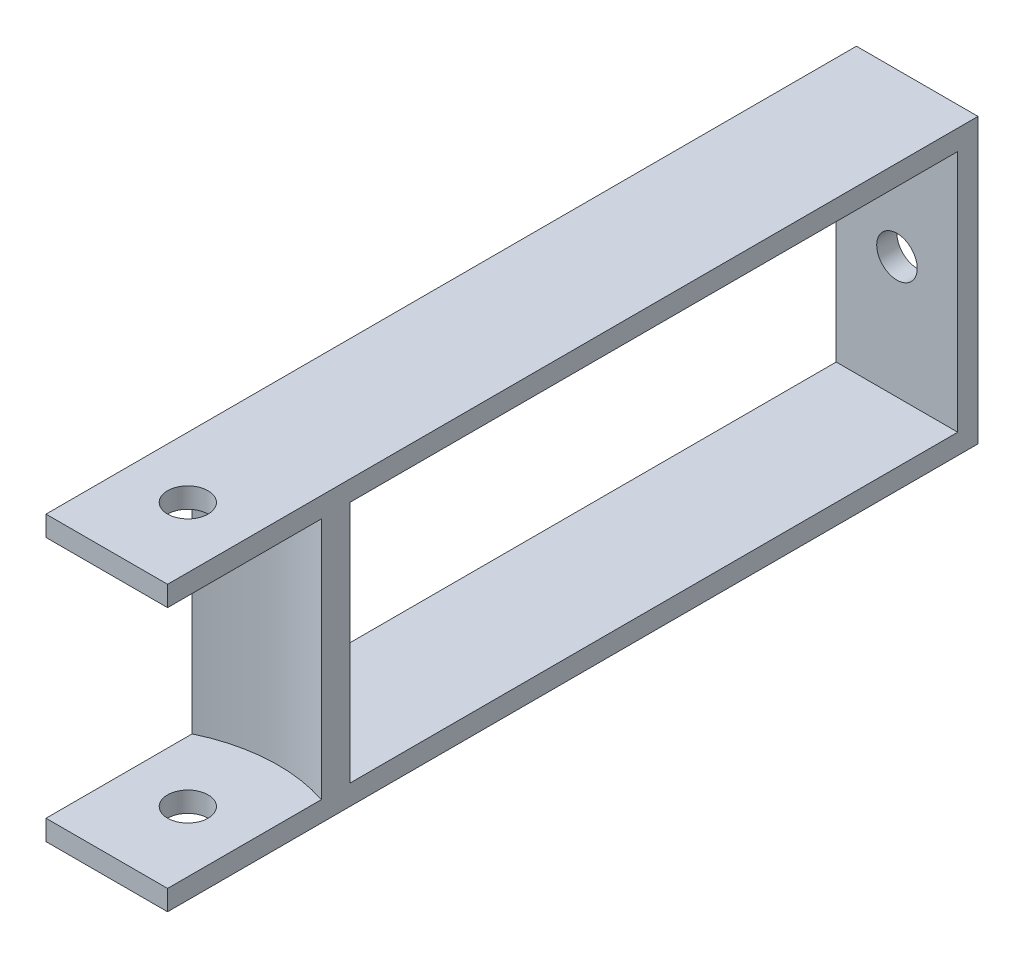
ISO-10303-21;
HEADER;
FILE_DESCRIPTION(('STEP AP214'),'2;1');
FILE_NAME('part.step','',(''),(''),'','','');
FILE_SCHEMA(('AUTOMOTIVE_DESIGN { 1 0 10303 214 1 1 1 1 }'));
ENDSEC;
DATA;
#1=APPLICATION_CONTEXT('core data for automotive mechanical design processes');
#2=APPLICATION_PROTOCOL_DEFINITION('international standard','automotive_design',2000,#1);
#3=PRODUCT_CONTEXT('',#1,'mechanical');
#4=PRODUCT('Part','Part','',(#3));
#5=PRODUCT_RELATED_PRODUCT_CATEGORY('part','',(#4));
#6=PRODUCT_DEFINITION_FORMATION('','',#4);
#7=PRODUCT_DEFINITION_CONTEXT('part definition',#1,'design');
#8=PRODUCT_DEFINITION('design','',#6,#7);
#9=PRODUCT_DEFINITION_SHAPE('','',#8);
#10=(LENGTH_UNIT() NAMED_UNIT(*) SI_UNIT(.MILLI.,.METRE.));
#11=(NAMED_UNIT(*) PLANE_ANGLE_UNIT() SI_UNIT($,.RADIAN.));
#12=(NAMED_UNIT(*) SI_UNIT($,.STERADIAN.) SOLID_ANGLE_UNIT());
#13=UNCERTAINTY_MEASURE_WITH_UNIT(LENGTH_MEASURE(1.E-05),#10,'distance_accuracy_value','');
#14=(GEOMETRIC_REPRESENTATION_CONTEXT(3) GLOBAL_UNCERTAINTY_ASSIGNED_CONTEXT((#13)) GLOBAL_UNIT_ASSIGNED_CONTEXT((#10,
#11,#12)) REPRESENTATION_CONTEXT('',''));
#15=CARTESIAN_POINT('',(0.,0.,0.));
#16=DIRECTION('',(0.,0.,1.));
#17=DIRECTION('',(1.,0.,0.));
#18=AXIS2_PLACEMENT_3D('',#15,#16,#17);
#19=CARTESIAN_POINT('',(0.,0.,200.));
#20=DIRECTION('',(0.,0.,-1.));
#21=DIRECTION('',(-1.,0.,0.));
#22=AXIS2_PLACEMENT_3D('',#19,#20,#21);
#23=PLANE('',#22);
#24=DIRECTION('',(-1.,0.,0.));
#25=VECTOR('',#24,1.);
#26=CARTESIAN_POINT('',(0.,43.2919254658385,200.));
#27=LINE('',#26,#25);
#28=CARTESIAN_POINT('',(19.9378881987578,43.2919254658385,200.));
#29=VERTEX_POINT('',#28);
#30=CARTESIAN_POINT('',(-10.0621118012422,43.2919254658385,200.));
#31=VERTEX_POINT('',#30);
#32=EDGE_CURVE('E223',#29,#31,#27,.T.);
#33=ORIENTED_EDGE('',*,*,#32,.F.);
#34=DIRECTION('',(0.,1.,0.));
#35=VECTOR('',#34,1.);
#36=CARTESIAN_POINT('',(19.9378881987578,-21.7080745341615,200.));
#37=LINE('',#36,#35);
#38=CARTESIAN_POINT('',(19.9378881987578,48.2919254658385,200.));
#39=VERTEX_POINT('',#38);
#40=EDGE_CURVE('E197',#29,#39,#37,.T.);
#41=ORIENTED_EDGE('',*,*,#40,.T.);
#42=DIRECTION('',(-1.,0.,0.));
#43=VECTOR('',#42,1.);
#44=CARTESIAN_POINT('',(-10.0621118012422,48.2919254658385,200.));
#45=LINE('',#44,#43);
#46=CARTESIAN_POINT('',(-10.0621118012422,48.2919254658385,200.));
#47=VERTEX_POINT('',#46);
#48=EDGE_CURVE('E201',#39,#47,#45,.T.);
#49=ORIENTED_EDGE('',*,*,#48,.T.);
#50=DIRECTION('',(0.,-1.,0.));
#51=VECTOR('',#50,1.);
#52=CARTESIAN_POINT('',(-10.0621118012422,-21.7080745341615,200.));
#53=LINE('',#52,#51);
#54=EDGE_CURVE('E191',#47,#31,#53,.T.);
#55=ORIENTED_EDGE('',*,*,#54,.T.);
#56=EDGE_LOOP('',(#33,#41,#49,#55));
#57=FACE_BOUND('',#56,.T.);
#58=ADVANCED_FACE('F38',(#57),#23,.F.);
#59=CARTESIAN_POINT('',(-10.0621118012422,-21.7080745341615,200.));
#60=DIRECTION('',(1.,0.,0.));
#61=DIRECTION('',(0.,1.,0.));
#62=AXIS2_PLACEMENT_3D('',#59,#60,#61);
#63=PLANE('',#62);
#64=DIRECTION('',(0.,0.,1.));
#65=VECTOR('',#64,1.);
#66=CARTESIAN_POINT('',(-10.0621118012422,-16.7080745341615,5.00000000000001));
#67=LINE('',#66,#65);
#68=CARTESIAN_POINT('',(-10.0621118012422,-16.7080745341615,5.));
#69=VERTEX_POINT('',#68);
#70=CARTESIAN_POINT('',(-10.0621118012422,-16.7080745341615,155.));
#71=VERTEX_POINT('',#70);
#72=EDGE_CURVE('E159',#69,#71,#67,.T.);
#73=ORIENTED_EDGE('',*,*,#72,.F.);
#74=DIRECTION('',(0.,-1.,0.));
#75=VECTOR('',#74,1.);
#76=CARTESIAN_POINT('',(-10.0621118012422,43.2919254658385,5.));
#77=LINE('',#76,#75);
#78=CARTESIAN_POINT('',(-10.0621118012422,43.2919254658385,5.));
#79=VERTEX_POINT('',#78);
#80=EDGE_CURVE('E55',#79,#69,#77,.T.);
#81=ORIENTED_EDGE('',*,*,#80,.F.);
#82=DIRECTION('',(0.,0.,-1.));
#83=VECTOR('',#82,1.);
#84=CARTESIAN_POINT('',(-10.0621118012422,43.2919254658385,5.));
#85=LINE('',#84,#83);
#86=CARTESIAN_POINT('',(-10.0621118012422,43.2919254658385,155.));
#87=VERTEX_POINT('',#86);
#88=EDGE_CURVE('E147',#87,#79,#85,.T.);
#89=ORIENTED_EDGE('',*,*,#88,.F.);
#90=DIRECTION('',(0.,1.,0.));
#91=VECTOR('',#90,1.);
#92=CARTESIAN_POINT('',(-10.0621118012422,43.2919254658385,155.));
#93=LINE('',#92,#91);
#94=EDGE_CURVE('E150',#71,#87,#93,.T.);
#95=ORIENTED_EDGE('',*,*,#94,.F.);
#96=EDGE_LOOP('',(#73,#81,#89,#95));
#97=FACE_BOUND('',#96,.T.);
#98=CARTESIAN_POINT('',(-10.0621118012422,-16.7080745341615,200.));
#99=VERTEX_POINT('',#98);
#100=CARTESIAN_POINT('',(-10.0621118012422,-21.7080745341615,200.));
#101=VERTEX_POINT('',#100);
#102=EDGE_CURVE('E195',#99,#101,#53,.T.);
#103=ORIENTED_EDGE('',*,*,#102,.F.);
#104=DIRECTION('',(0.,0.,-1.));
#105=VECTOR('',#104,1.);
#106=CARTESIAN_POINT('',(-10.0621118012422,-16.7080745341615,200.));
#107=LINE('',#106,#105);
#108=CARTESIAN_POINT('',(-10.0621118012422,-16.7080745341615,163.943139812882));
#109=VERTEX_POINT('',#108);
#110=EDGE_CURVE('E182',#99,#109,#107,.T.);
#111=ORIENTED_EDGE('',*,*,#110,.T.);
#112=DIRECTION('',(0.,1.,0.));
#113=VECTOR('',#112,1.);
#114=CARTESIAN_POINT('',(-10.0621118012422,-16.7080745341615,163.943139812882));
#115=LINE('',#114,#113);
#116=CARTESIAN_POINT('',(-10.0621118012422,43.2919254658385,163.943139812882));
#117=VERTEX_POINT('',#116);
#118=EDGE_CURVE('E185',#117,#109,#115,.F.);
#119=ORIENTED_EDGE('',*,*,#118,.F.);
#120=DIRECTION('',(0.,0.,-1.));
#121=VECTOR('',#120,1.);
#122=CARTESIAN_POINT('',(-10.0621118012422,43.2919254658385,200.));
#123=LINE('',#122,#121);
#124=EDGE_CURVE('E177',#31,#117,#123,.T.);
#125=ORIENTED_EDGE('',*,*,#124,.F.);
#126=ORIENTED_EDGE('',*,*,#54,.F.);
#127=DIRECTION('',(0.,0.,-1.));
#128=VECTOR('',#127,1.);
#129=CARTESIAN_POINT('',(-10.0621118012422,48.2919254658385,200.));
#130=LINE('',#129,#128);
#131=CARTESIAN_POINT('',(-10.0621118012422,48.2919254658385,0.));
#132=VERTEX_POINT('',#131);
#133=EDGE_CURVE('E203',#47,#132,#130,.T.);
#134=ORIENTED_EDGE('',*,*,#133,.T.);
#135=DIRECTION('',(0.,-1.,0.));
#136=VECTOR('',#135,1.);
#137=CARTESIAN_POINT('',(-10.0621118012422,-21.7080745341615,0.));
#138=LINE('',#137,#136);
#139=CARTESIAN_POINT('',(-10.0621118012422,-21.7080745341615,0.));
#140=VERTEX_POINT('',#139);
#141=EDGE_CURVE('E190',#132,#140,#138,.T.);
#142=ORIENTED_EDGE('',*,*,#141,.T.);
#143=DIRECTION('',(0.,0.,-1.));
#144=VECTOR('',#143,1.);
#145=CARTESIAN_POINT('',(-10.0621118012422,-21.7080745341615,200.));
#146=LINE('',#145,#144);
#147=EDGE_CURVE('E220',#101,#140,#146,.T.);
#148=ORIENTED_EDGE('',*,*,#147,.F.);
#149=EDGE_LOOP('',(#103,#111,#119,#125,#126,#134,#142,#148));
#150=FACE_BOUND('',#149,.T.);
#151=ADVANCED_FACE('F40',(#97,#150),#63,.F.);
#152=CARTESIAN_POINT('',(-10.0621118012422,-21.7080745341615,200.));
#153=DIRECTION('',(0.,1.,0.));
#154=DIRECTION('',(0.,0.,1.));
#155=AXIS2_PLACEMENT_3D('',#152,#153,#154);
#156=PLANE('',#155);
#157=CARTESIAN_POINT('',(4.93788819875779,-21.7080745341615,180.));
#158=DIRECTION('',(0.,-1.,0.));
#159=DIRECTION('',(0.,0.,-1.));
#160=AXIS2_PLACEMENT_3D('',#157,#158,#159);
#161=CIRCLE('',#160,5.);
#162=CARTESIAN_POINT('',(4.93788819875779,-21.7080745341615,175.));
#163=VERTEX_POINT('',#162);
#164=EDGE_CURVE('E304',#163,#163,#161,.T.);
#165=ORIENTED_EDGE('',*,*,#164,.F.);
#166=EDGE_LOOP('',(#165));
#167=FACE_BOUND('',#166,.T.);
#168=DIRECTION('',(1.,0.,0.));
#169=VECTOR('',#168,1.);
#170=CARTESIAN_POINT('',(-10.0621118012422,-21.7080745341615,0.));
#171=LINE('',#170,#169);
#172=CARTESIAN_POINT('',(19.9378881987578,-21.7080745341615,0.));
#173=VERTEX_POINT('',#172);
#174=EDGE_CURVE('E206',#140,#173,#171,.T.);
#175=ORIENTED_EDGE('',*,*,#174,.T.);
#176=DIRECTION('',(0.,0.,-1.));
#177=VECTOR('',#176,1.);
#178=CARTESIAN_POINT('',(19.9378881987578,-21.7080745341615,200.));
#179=LINE('',#178,#177);
#180=CARTESIAN_POINT('',(19.9378881987578,-21.7080745341615,200.));
#181=VERTEX_POINT('',#180);
#182=EDGE_CURVE('E217',#181,#173,#179,.T.);
#183=ORIENTED_EDGE('',*,*,#182,.F.);
#184=DIRECTION('',(1.,0.,0.));
#185=VECTOR('',#184,1.);
#186=CARTESIAN_POINT('',(-10.0621118012422,-21.7080745341615,200.));
#187=LINE('',#186,#185);
#188=EDGE_CURVE('E194',#101,#181,#187,.T.);
#189=ORIENTED_EDGE('',*,*,#188,.F.);
#190=ORIENTED_EDGE('',*,*,#147,.T.);
#191=EDGE_LOOP('',(#175,#183,#189,#190));
#192=FACE_BOUND('',#191,.T.);
#193=ADVANCED_FACE('F253',(#167,#192),#156,.F.);
#194=CARTESIAN_POINT('',(19.9378881987578,-21.7080745341615,200.));
#195=DIRECTION('',(-1.,0.,0.));
#196=DIRECTION('',(0.,0.,1.));
#197=AXIS2_PLACEMENT_3D('',#194,#195,#196);
#198=PLANE('',#197);
#199=DIRECTION('',(0.,0.,-1.));
#200=VECTOR('',#199,1.);
#201=CARTESIAN_POINT('',(19.9378881987578,43.2919254658385,5.));
#202=LINE('',#201,#200);
#203=CARTESIAN_POINT('',(19.9378881987578,43.2919254658385,155.));
#204=VERTEX_POINT('',#203);
#205=CARTESIAN_POINT('',(19.9378881987578,43.2919254658385,5.));
#206=VERTEX_POINT('',#205);
#207=EDGE_CURVE('E137',#204,#206,#202,.T.);
#208=ORIENTED_EDGE('',*,*,#207,.T.);
#209=DIRECTION('',(0.,-1.,0.));
#210=VECTOR('',#209,1.);
#211=CARTESIAN_POINT('',(19.9378881987578,43.2919254658385,5.));
#212=LINE('',#211,#210);
#213=CARTESIAN_POINT('',(19.9378881987578,-16.7080745341615,5.00000000000001));
#214=VERTEX_POINT('',#213);
#215=EDGE_CURVE('E131',#206,#214,#212,.T.);
#216=ORIENTED_EDGE('',*,*,#215,.T.);
#217=DIRECTION('',(0.,0.,1.));
#218=VECTOR('',#217,1.);
#219=CARTESIAN_POINT('',(19.9378881987578,-16.7080745341615,5.00000000000001));
#220=LINE('',#219,#218);
#221=CARTESIAN_POINT('',(19.9378881987578,-16.7080745341615,155.));
#222=VERTEX_POINT('',#221);
#223=EDGE_CURVE('E140',#214,#222,#220,.T.);
#224=ORIENTED_EDGE('',*,*,#223,.T.);
#225=DIRECTION('',(0.,1.,0.));
#226=VECTOR('',#225,1.);
#227=CARTESIAN_POINT('',(19.9378881987578,43.2919254658385,155.));
#228=LINE('',#227,#226);
#229=EDGE_CURVE('E63',#222,#204,#228,.T.);
#230=ORIENTED_EDGE('',*,*,#229,.T.);
#231=EDGE_LOOP('',(#208,#216,#224,#230));
#232=FACE_BOUND('',#231,.T.);
#233=DIRECTION('',(0.,1.,0.));
#234=VECTOR('',#233,1.);
#235=CARTESIAN_POINT('',(19.9378881987578,-16.7080745341615,162.06374636238));
#236=LINE('',#235,#234);
#237=CARTESIAN_POINT('',(19.9378881987578,-16.7080745341615,162.06374636238));
#238=VERTEX_POINT('',#237);
#239=CARTESIAN_POINT('',(19.9378881987578,43.2919254658385,162.06374636238));
#240=VERTEX_POINT('',#239);
#241=EDGE_CURVE('E11',#238,#240,#236,.T.);
#242=ORIENTED_EDGE('',*,*,#241,.F.);
#243=DIRECTION('',(0.,0.,1.));
#244=VECTOR('',#243,1.);
#245=CARTESIAN_POINT('',(19.9378881987578,-16.7080745341615,200.));
#246=LINE('',#245,#244);
#247=CARTESIAN_POINT('',(19.9378881987578,-16.7080745341615,200.));
#248=VERTEX_POINT('',#247);
#249=EDGE_CURVE('E179',#238,#248,#246,.T.);
#250=ORIENTED_EDGE('',*,*,#249,.T.);
#251=EDGE_CURVE('E198',#181,#248,#37,.T.);
#252=ORIENTED_EDGE('',*,*,#251,.F.);
#253=ORIENTED_EDGE('',*,*,#182,.T.);
#254=DIRECTION('',(0.,1.,0.));
#255=VECTOR('',#254,1.);
#256=CARTESIAN_POINT('',(19.9378881987578,-21.7080745341615,0.));
#257=LINE('',#256,#255);
#258=CARTESIAN_POINT('',(19.9378881987578,48.2919254658385,0.));
#259=VERTEX_POINT('',#258);
#260=EDGE_CURVE('E208',#173,#259,#257,.T.);
#261=ORIENTED_EDGE('',*,*,#260,.T.);
#262=DIRECTION('',(0.,0.,-1.));
#263=VECTOR('',#262,1.);
#264=CARTESIAN_POINT('',(19.9378881987578,48.2919254658385,200.));
#265=LINE('',#264,#263);
#266=EDGE_CURVE('E214',#39,#259,#265,.T.);
#267=ORIENTED_EDGE('',*,*,#266,.F.);
#268=ORIENTED_EDGE('',*,*,#40,.F.);
#269=DIRECTION('',(0.,0.,1.));
#270=VECTOR('',#269,1.);
#271=CARTESIAN_POINT('',(19.9378881987578,43.2919254658385,200.));
#272=LINE('',#271,#270);
#273=EDGE_CURVE('E175',#240,#29,#272,.T.);
#274=ORIENTED_EDGE('',*,*,#273,.F.);
#275=EDGE_LOOP('',(#242,#250,#252,#253,#261,#267,#268,#274));
#276=FACE_BOUND('',#275,.T.);
#277=ADVANCED_FACE('F144',(#232,#276),#198,.F.);
#278=CARTESIAN_POINT('',(-10.0621118012422,48.2919254658385,200.));
#279=DIRECTION('',(0.,-1.,0.));
#280=DIRECTION('',(0.,0.,-1.));
#281=AXIS2_PLACEMENT_3D('',#278,#279,#280);
#282=PLANE('',#281);
#283=CARTESIAN_POINT('',(4.93788819875779,48.2919254658385,180.));
#284=DIRECTION('',(0.,-1.,0.));
#285=DIRECTION('',(0.,0.,-1.));
#286=AXIS2_PLACEMENT_3D('',#283,#284,#285);
#287=CIRCLE('',#286,5.);
#288=CARTESIAN_POINT('',(4.93788819875779,48.2919254658385,175.));
#289=VERTEX_POINT('',#288);
#290=EDGE_CURVE('E306',#289,#289,#287,.T.);
#291=ORIENTED_EDGE('',*,*,#290,.T.);
#292=EDGE_LOOP('',(#291));
#293=FACE_BOUND('',#292,.T.);
#294=DIRECTION('',(-1.,0.,0.));
#295=VECTOR('',#294,1.);
#296=CARTESIAN_POINT('',(-10.0621118012422,48.2919254658385,0.));
#297=LINE('',#296,#295);
#298=EDGE_CURVE('E210',#259,#132,#297,.T.);
#299=ORIENTED_EDGE('',*,*,#298,.T.);
#300=ORIENTED_EDGE('',*,*,#133,.F.);
#301=ORIENTED_EDGE('',*,*,#48,.F.);
#302=ORIENTED_EDGE('',*,*,#266,.T.);
#303=EDGE_LOOP('',(#299,#300,#301,#302));
#304=FACE_BOUND('',#303,.T.);
#305=ADVANCED_FACE('F260',(#293,#304),#282,.F.);
#306=ORIENTED_EDGE('',*,*,#251,.T.);
#307=DIRECTION('',(-1.,0.,0.));
#308=VECTOR('',#307,1.);
#309=CARTESIAN_POINT('',(0.,-16.7080745341615,200.));
#310=LINE('',#309,#308);
#311=EDGE_CURVE('E47',#248,#99,#310,.T.);
#312=ORIENTED_EDGE('',*,*,#311,.T.);
#313=ORIENTED_EDGE('',*,*,#102,.T.);
#314=ORIENTED_EDGE('',*,*,#188,.T.);
#315=EDGE_LOOP('',(#306,#312,#313,#314));
#316=FACE_BOUND('',#315,.T.);
#317=ADVANCED_FACE('F249',(#316),#23,.F.);
#318=CARTESIAN_POINT('',(0.,0.,0.));
#319=DIRECTION('',(0.,0.,-1.));
#320=DIRECTION('',(-1.,0.,0.));
#321=AXIS2_PLACEMENT_3D('',#318,#319,#320);
#322=PLANE('',#321);
#323=CARTESIAN_POINT('',(4.93788819875779,13.2919254658385,0.));
#324=DIRECTION('',(0.,0.,-1.));
#325=DIRECTION('',(-1.,0.,0.));
#326=AXIS2_PLACEMENT_3D('',#323,#324,#325);
#327=CIRCLE('',#326,5.);
#328=CARTESIAN_POINT('',(-0.0621118012422133,13.2919254658385,0.));
#329=VERTEX_POINT('',#328);
#330=EDGE_CURVE('E187',#329,#329,#327,.T.);
#331=ORIENTED_EDGE('',*,*,#330,.F.);
#332=EDGE_LOOP('',(#331));
#333=FACE_BOUND('',#332,.T.);
#334=ORIENTED_EDGE('',*,*,#141,.F.);
#335=ORIENTED_EDGE('',*,*,#298,.F.);
#336=ORIENTED_EDGE('',*,*,#260,.F.);
#337=ORIENTED_EDGE('',*,*,#174,.F.);
#338=EDGE_LOOP('',(#334,#335,#336,#337));
#339=FACE_BOUND('',#338,.T.);
#340=ADVANCED_FACE('F259',(#333,#339),#322,.T.);
#341=CARTESIAN_POINT('',(4.93788819875779,13.2919254658385,20.));
#342=DIRECTION('',(0.,0.,-1.));
#343=DIRECTION('',(-1.,0.,0.));
#344=AXIS2_PLACEMENT_3D('',#341,#342,#343);
#345=CYLINDRICAL_SURFACE('',#344,5.);
#346=CARTESIAN_POINT('',(4.93788819875779,13.2919254658385,5.));
#347=DIRECTION('',(0.,0.,-1.));
#348=DIRECTION('',(0.,1.,0.));
#349=AXIS2_PLACEMENT_3D('',#346,#347,#348);
#350=CIRCLE('',#349,5.);
#351=CARTESIAN_POINT('',(4.93788819875779,18.2919254658385,5.));
#352=VERTEX_POINT('',#351);
#353=EDGE_CURVE('E165',#352,#352,#350,.F.);
#354=ORIENTED_EDGE('',*,*,#353,.T.);
#355=EDGE_LOOP('',(#354));
#356=FACE_BOUND('',#355,.T.);
#357=ORIENTED_EDGE('',*,*,#330,.T.);
#358=EDGE_LOOP('',(#357));
#359=FACE_BOUND('',#358,.T.);
#360=ADVANCED_FACE('F229',(#356,#359),#345,.F.);
#361=CARTESIAN_POINT('',(7.25559109049811,-16.7080745341615,200.));
#362=DIRECTION('',(0.,1.,0.));
#363=DIRECTION('',(0.,0.,1.));
#364=AXIS2_PLACEMENT_3D('',#361,#362,#363);
#365=CYLINDRICAL_SURFACE('',#364,40.);
#366=ORIENTED_EDGE('',*,*,#118,.T.);
#367=CARTESIAN_POINT('',(7.25559109049811,-16.7080745341615,200.));
#368=DIRECTION('',(0.,-1.,0.));
#369=DIRECTION('',(0.,0.,-1.));
#370=AXIS2_PLACEMENT_3D('',#367,#368,#369);
#371=CIRCLE('',#370,40.);
#372=EDGE_CURVE('E172',#109,#238,#371,.T.);
#373=ORIENTED_EDGE('',*,*,#372,.T.);
#374=ORIENTED_EDGE('',*,*,#241,.T.);
#375=CARTESIAN_POINT('',(7.25559109049811,43.2919254658385,200.));
#376=DIRECTION('',(0.,-1.,0.));
#377=DIRECTION('',(0.,0.,-1.));
#378=AXIS2_PLACEMENT_3D('',#375,#376,#377);
#379=CIRCLE('',#378,40.);
#380=EDGE_CURVE('E169',#117,#240,#379,.T.);
#381=ORIENTED_EDGE('',*,*,#380,.F.);
#382=EDGE_LOOP('',(#366,#373,#374,#381));
#383=FACE_BOUND('',#382,.T.);
#384=ADVANCED_FACE('F279',(#383),#365,.F.);
#385=CARTESIAN_POINT('',(7.25559109049811,-16.7080745341615,200.));
#386=DIRECTION('',(0.,-1.,0.));
#387=DIRECTION('',(0.,0.,-1.));
#388=AXIS2_PLACEMENT_3D('',#385,#386,#387);
#389=PLANE('',#388);
#390=CARTESIAN_POINT('',(4.93788819875779,-16.7080745341615,180.));
#391=DIRECTION('',(0.,-1.,0.));
#392=DIRECTION('',(0.,0.,-1.));
#393=AXIS2_PLACEMENT_3D('',#390,#391,#392);
#394=CIRCLE('',#393,5.);
#395=CARTESIAN_POINT('',(4.93788819875779,-16.7080745341615,175.));
#396=VERTEX_POINT('',#395);
#397=EDGE_CURVE('E153',#396,#396,#394,.T.);
#398=ORIENTED_EDGE('',*,*,#397,.T.);
#399=EDGE_LOOP('',(#398));
#400=FACE_BOUND('',#399,.T.);
#401=ORIENTED_EDGE('',*,*,#311,.F.);
#402=ORIENTED_EDGE('',*,*,#249,.F.);
#403=ORIENTED_EDGE('',*,*,#372,.F.);
#404=ORIENTED_EDGE('',*,*,#110,.F.);
#405=EDGE_LOOP('',(#401,#402,#403,#404));
#406=FACE_BOUND('',#405,.T.);
#407=ADVANCED_FACE('F242',(#400,#406),#389,.F.);
#408=CARTESIAN_POINT('',(7.25559109049811,43.2919254658385,200.));
#409=DIRECTION('',(0.,-1.,0.));
#410=DIRECTION('',(0.,0.,-1.));
#411=AXIS2_PLACEMENT_3D('',#408,#409,#410);
#412=PLANE('',#411);
#413=CARTESIAN_POINT('',(4.93788819875779,43.2919254658385,180.));
#414=DIRECTION('',(0.,-1.,0.));
#415=DIRECTION('',(0.,0.,-1.));
#416=AXIS2_PLACEMENT_3D('',#413,#414,#415);
#417=CIRCLE('',#416,5.);
#418=CARTESIAN_POINT('',(4.93788819875779,43.2919254658385,175.));
#419=VERTEX_POINT('',#418);
#420=EDGE_CURVE('E42',#419,#419,#417,.T.);
#421=ORIENTED_EDGE('',*,*,#420,.F.);
#422=EDGE_LOOP('',(#421));
#423=FACE_BOUND('',#422,.T.);
#424=ORIENTED_EDGE('',*,*,#124,.T.);
#425=ORIENTED_EDGE('',*,*,#380,.T.);
#426=ORIENTED_EDGE('',*,*,#273,.T.);
#427=ORIENTED_EDGE('',*,*,#32,.T.);
#428=EDGE_LOOP('',(#424,#425,#426,#427));
#429=FACE_BOUND('',#428,.T.);
#430=ADVANCED_FACE('F233',(#423,#429),#412,.T.);
#431=CARTESIAN_POINT('',(19.9378881987578,43.2919254658385,5.));
#432=DIRECTION('',(0.,0.,-1.));
#433=DIRECTION('',(0.,1.,0.));
#434=AXIS2_PLACEMENT_3D('',#431,#432,#433);
#435=PLANE('',#434);
#436=ORIENTED_EDGE('',*,*,#80,.T.);
#437=DIRECTION('',(-1.,0.,0.));
#438=VECTOR('',#437,1.);
#439=CARTESIAN_POINT('',(19.9378881987578,-16.7080745341615,5.00000000000001));
#440=LINE('',#439,#438);
#441=EDGE_CURVE('E126',#214,#69,#440,.T.);
#442=ORIENTED_EDGE('',*,*,#441,.F.);
#443=ORIENTED_EDGE('',*,*,#215,.F.);
#444=DIRECTION('',(-1.,0.,0.));
#445=VECTOR('',#444,1.);
#446=CARTESIAN_POINT('',(19.9378881987578,43.2919254658385,5.));
#447=LINE('',#446,#445);
#448=EDGE_CURVE('E163',#206,#79,#447,.T.);
#449=ORIENTED_EDGE('',*,*,#448,.T.);
#450=EDGE_LOOP('',(#436,#442,#443,#449));
#451=FACE_BOUND('',#450,.T.);
#452=ORIENTED_EDGE('',*,*,#353,.F.);
#453=EDGE_LOOP('',(#452));
#454=FACE_BOUND('',#453,.T.);
#455=ADVANCED_FACE('F128',(#451,#454),#435,.F.);
#456=CARTESIAN_POINT('',(19.9378881987578,43.2919254658385,5.));
#457=DIRECTION('',(0.,1.,0.));
#458=DIRECTION('',(-1.,0.,0.));
#459=AXIS2_PLACEMENT_3D('',#456,#457,#458);
#460=PLANE('',#459);
#461=ORIENTED_EDGE('',*,*,#88,.T.);
#462=ORIENTED_EDGE('',*,*,#448,.F.);
#463=ORIENTED_EDGE('',*,*,#207,.F.);
#464=DIRECTION('',(-1.,0.,0.));
#465=VECTOR('',#464,1.);
#466=CARTESIAN_POINT('',(19.9378881987578,43.2919254658385,155.));
#467=LINE('',#466,#465);
#468=EDGE_CURVE('E166',#204,#87,#467,.T.);
#469=ORIENTED_EDGE('',*,*,#468,.T.);
#470=EDGE_LOOP('',(#461,#462,#463,#469));
#471=FACE_BOUND('',#470,.T.);
#472=ADVANCED_FACE('F232',(#471),#460,.F.);
#473=CARTESIAN_POINT('',(19.9378881987578,43.2919254658385,155.));
#474=DIRECTION('',(0.,0.,1.));
#475=DIRECTION('',(1.,0.,0.));
#476=AXIS2_PLACEMENT_3D('',#473,#474,#475);
#477=PLANE('',#476);
#478=ORIENTED_EDGE('',*,*,#94,.T.);
#479=ORIENTED_EDGE('',*,*,#468,.F.);
#480=ORIENTED_EDGE('',*,*,#229,.F.);
#481=DIRECTION('',(-1.,0.,0.));
#482=VECTOR('',#481,1.);
#483=CARTESIAN_POINT('',(19.9378881987578,-16.7080745341615,155.));
#484=LINE('',#483,#482);
#485=EDGE_CURVE('E136',#222,#71,#484,.T.);
#486=ORIENTED_EDGE('',*,*,#485,.T.);
#487=EDGE_LOOP('',(#478,#479,#480,#486));
#488=FACE_BOUND('',#487,.T.);
#489=ADVANCED_FACE('F239',(#488),#477,.F.);
#490=CARTESIAN_POINT('',(19.9378881987578,-16.7080745341615,5.00000000000001));
#491=DIRECTION('',(0.,-1.,0.));
#492=DIRECTION('',(1.,0.,0.));
#493=AXIS2_PLACEMENT_3D('',#490,#491,#492);
#494=PLANE('',#493);
#495=ORIENTED_EDGE('',*,*,#72,.T.);
#496=ORIENTED_EDGE('',*,*,#485,.F.);
#497=ORIENTED_EDGE('',*,*,#223,.F.);
#498=ORIENTED_EDGE('',*,*,#441,.T.);
#499=EDGE_LOOP('',(#495,#496,#497,#498));
#500=FACE_BOUND('',#499,.T.);
#501=ADVANCED_FACE('F141',(#500),#494,.F.);
#502=CARTESIAN_POINT('',(4.93788819875779,48.2919254658385,180.));
#503=DIRECTION('',(0.,-1.,0.));
#504=DIRECTION('',(0.,0.,-1.));
#505=AXIS2_PLACEMENT_3D('',#502,#503,#504);
#506=CYLINDRICAL_SURFACE('',#505,5.);
#507=ORIENTED_EDGE('',*,*,#420,.T.);
#508=EDGE_LOOP('',(#507));
#509=FACE_BOUND('',#508,.T.);
#510=ORIENTED_EDGE('',*,*,#290,.F.);
#511=EDGE_LOOP('',(#510));
#512=FACE_BOUND('',#511,.T.);
#513=ADVANCED_FACE('F319',(#509,#512),#506,.F.);
#514=ORIENTED_EDGE('',*,*,#164,.T.);
#515=EDGE_LOOP('',(#514));
#516=FACE_BOUND('',#515,.T.);
#517=ORIENTED_EDGE('',*,*,#397,.F.);
#518=EDGE_LOOP('',(#517));
#519=FACE_BOUND('',#518,.T.);
#520=ADVANCED_FACE('F317',(#516,#519),#506,.F.);
#521=CLOSED_SHELL('',(#58,#151,#193,#277,#305,#317,#340,#360,#384,#407,#430,#455,#472,#489,#501,
#513,#520));
#522=MANIFOLD_SOLID_BREP('B2',#521);
#523=ADVANCED_BREP_SHAPE_REPRESENTATION('',(#18,#522),#14);
#524=SHAPE_DEFINITION_REPRESENTATION(#9,#523);
ENDSEC;
END-ISO-10303-21;
